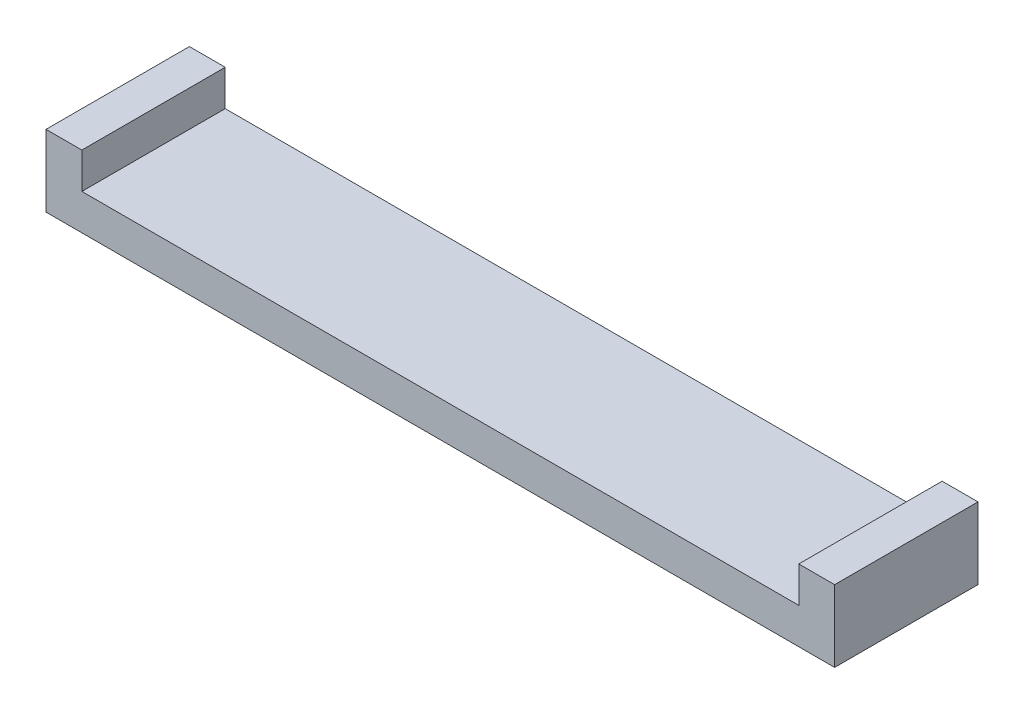
ISO-10303-21;
HEADER;
FILE_DESCRIPTION(('STEP AP214'),'2;1');
FILE_NAME('part.step','',(''),(''),'','','');
FILE_SCHEMA(('AUTOMOTIVE_DESIGN { 1 0 10303 214 1 1 1 1 }'));
ENDSEC;
DATA;
#1=APPLICATION_CONTEXT('core data for automotive mechanical design processes');
#2=APPLICATION_PROTOCOL_DEFINITION('international standard','automotive_design',2000,#1);
#3=PRODUCT_CONTEXT('',#1,'mechanical');
#4=PRODUCT('Part','Part','',(#3));
#5=PRODUCT_RELATED_PRODUCT_CATEGORY('part','',(#4));
#6=PRODUCT_DEFINITION_FORMATION('','',#4);
#7=PRODUCT_DEFINITION_CONTEXT('part definition',#1,'design');
#8=PRODUCT_DEFINITION('design','',#6,#7);
#9=PRODUCT_DEFINITION_SHAPE('','',#8);
#10=(LENGTH_UNIT() NAMED_UNIT(*) SI_UNIT(.MILLI.,.METRE.));
#11=(NAMED_UNIT(*) PLANE_ANGLE_UNIT() SI_UNIT($,.RADIAN.));
#12=(NAMED_UNIT(*) SI_UNIT($,.STERADIAN.) SOLID_ANGLE_UNIT());
#13=UNCERTAINTY_MEASURE_WITH_UNIT(LENGTH_MEASURE(1.E-05),#10,'distance_accuracy_value','');
#14=(GEOMETRIC_REPRESENTATION_CONTEXT(3) GLOBAL_UNCERTAINTY_ASSIGNED_CONTEXT((#13)) GLOBAL_UNIT_ASSIGNED_CONTEXT((#10,
#11,#12)) REPRESENTATION_CONTEXT('',''));
#15=CARTESIAN_POINT('',(0.,0.,0.));
#16=DIRECTION('',(0.,0.,1.));
#17=DIRECTION('',(1.,0.,0.));
#18=AXIS2_PLACEMENT_3D('',#15,#16,#17);
#19=CARTESIAN_POINT('',(-5.,5.,20.));
#20=DIRECTION('',(1.,0.,0.));
#21=DIRECTION('',(0.,0.,-1.));
#22=AXIS2_PLACEMENT_3D('',#19,#20,#21);
#23=PLANE('',#22);
#24=DIRECTION('',(0.,-1.,0.));
#25=VECTOR('',#24,1.);
#26=CARTESIAN_POINT('',(-5.,5.,0.));
#27=LINE('',#26,#25);
#28=CARTESIAN_POINT('',(-5.,5.,0.));
#29=VERTEX_POINT('',#28);
#30=CARTESIAN_POINT('',(-5.,-5.,0.));
#31=VERTEX_POINT('',#30);
#32=EDGE_CURVE('E134',#29,#31,#27,.T.);
#33=ORIENTED_EDGE('',*,*,#32,.T.);
#34=DIRECTION('',(0.,0.,-1.));
#35=VECTOR('',#34,1.);
#36=CARTESIAN_POINT('',(-5.,-5.,20.));
#37=LINE('',#36,#35);
#38=CARTESIAN_POINT('',(-5.,-5.,20.));
#39=VERTEX_POINT('',#38);
#40=EDGE_CURVE('E11',#39,#31,#37,.T.);
#41=ORIENTED_EDGE('',*,*,#40,.F.);
#42=DIRECTION('',(0.,-1.,0.));
#43=VECTOR('',#42,1.);
#44=CARTESIAN_POINT('',(-5.,5.,20.));
#45=LINE('',#44,#43);
#46=CARTESIAN_POINT('',(-5.,5.,20.));
#47=VERTEX_POINT('',#46);
#48=EDGE_CURVE('E146',#47,#39,#45,.T.);
#49=ORIENTED_EDGE('',*,*,#48,.F.);
#50=DIRECTION('',(0.,0.,-1.));
#51=VECTOR('',#50,1.);
#52=CARTESIAN_POINT('',(-5.,5.,20.));
#53=LINE('',#52,#51);
#54=EDGE_CURVE('E131',#47,#29,#53,.T.);
#55=ORIENTED_EDGE('',*,*,#54,.T.);
#56=EDGE_LOOP('',(#33,#41,#49,#55));
#57=FACE_BOUND('',#56,.T.);
#58=ADVANCED_FACE('F39',(#57),#23,.F.);
#59=CARTESIAN_POINT('',(-5.,-5.,20.));
#60=DIRECTION('',(0.,1.,0.));
#61=DIRECTION('',(0.,0.,1.));
#62=AXIS2_PLACEMENT_3D('',#59,#60,#61);
#63=PLANE('',#62);
#64=DIRECTION('',(1.,0.,0.));
#65=VECTOR('',#64,1.);
#66=CARTESIAN_POINT('',(-5.,-5.,0.));
#67=LINE('',#66,#65);
#68=CARTESIAN_POINT('',(105.,-5.,0.));
#69=VERTEX_POINT('',#68);
#70=EDGE_CURVE('E138',#31,#69,#67,.T.);
#71=ORIENTED_EDGE('',*,*,#70,.T.);
#72=DIRECTION('',(0.,0.,-1.));
#73=VECTOR('',#72,1.);
#74=CARTESIAN_POINT('',(105.,-5.,20.));
#75=LINE('',#74,#73);
#76=CARTESIAN_POINT('',(105.,-5.,20.));
#77=VERTEX_POINT('',#76);
#78=EDGE_CURVE('E50',#77,#69,#75,.T.);
#79=ORIENTED_EDGE('',*,*,#78,.F.);
#80=DIRECTION('',(1.,0.,0.));
#81=VECTOR('',#80,1.);
#82=CARTESIAN_POINT('',(-5.,-5.,20.));
#83=LINE('',#82,#81);
#84=EDGE_CURVE('E97',#39,#77,#83,.T.);
#85=ORIENTED_EDGE('',*,*,#84,.F.);
#86=ORIENTED_EDGE('',*,*,#40,.T.);
#87=EDGE_LOOP('',(#71,#79,#85,#86));
#88=FACE_BOUND('',#87,.T.);
#89=ADVANCED_FACE('F182',(#88),#63,.F.);
#90=CARTESIAN_POINT('',(105.,-5.,20.));
#91=DIRECTION('',(-1.,0.,0.));
#92=DIRECTION('',(0.,0.,1.));
#93=AXIS2_PLACEMENT_3D('',#90,#91,#92);
#94=PLANE('',#93);
#95=DIRECTION('',(0.,1.,0.));
#96=VECTOR('',#95,1.);
#97=CARTESIAN_POINT('',(105.,-5.,0.));
#98=LINE('',#97,#96);
#99=CARTESIAN_POINT('',(105.,5.,0.));
#100=VERTEX_POINT('',#99);
#101=EDGE_CURVE('E139',#69,#100,#98,.T.);
#102=ORIENTED_EDGE('',*,*,#101,.T.);
#103=DIRECTION('',(0.,0.,-1.));
#104=VECTOR('',#103,1.);
#105=CARTESIAN_POINT('',(105.,5.,20.));
#106=LINE('',#105,#104);
#107=CARTESIAN_POINT('',(105.,5.,20.));
#108=VERTEX_POINT('',#107);
#109=EDGE_CURVE('E157',#108,#100,#106,.T.);
#110=ORIENTED_EDGE('',*,*,#109,.F.);
#111=DIRECTION('',(0.,1.,0.));
#112=VECTOR('',#111,1.);
#113=CARTESIAN_POINT('',(105.,-5.,20.));
#114=LINE('',#113,#112);
#115=EDGE_CURVE('E163',#77,#108,#114,.T.);
#116=ORIENTED_EDGE('',*,*,#115,.F.);
#117=ORIENTED_EDGE('',*,*,#78,.T.);
#118=EDGE_LOOP('',(#102,#110,#116,#117));
#119=FACE_BOUND('',#118,.T.);
#120=ADVANCED_FACE('F162',(#119),#94,.F.);
#121=CARTESIAN_POINT('',(105.,5.,20.));
#122=DIRECTION('',(0.,-1.,0.));
#123=DIRECTION('',(0.,0.,-1.));
#124=AXIS2_PLACEMENT_3D('',#121,#122,#123);
#125=PLANE('',#124);
#126=DIRECTION('',(-1.,0.,0.));
#127=VECTOR('',#126,1.);
#128=CARTESIAN_POINT('',(105.,5.,0.));
#129=LINE('',#128,#127);
#130=CARTESIAN_POINT('',(100.,5.,0.));
#131=VERTEX_POINT('',#130);
#132=EDGE_CURVE('E145',#100,#131,#129,.T.);
#133=ORIENTED_EDGE('',*,*,#132,.T.);
#134=DIRECTION('',(0.,0.,-1.));
#135=VECTOR('',#134,1.);
#136=CARTESIAN_POINT('',(100.,5.,20.));
#137=LINE('',#136,#135);
#138=CARTESIAN_POINT('',(100.,5.,20.));
#139=VERTEX_POINT('',#138);
#140=EDGE_CURVE('E154',#139,#131,#137,.T.);
#141=ORIENTED_EDGE('',*,*,#140,.F.);
#142=DIRECTION('',(-1.,0.,0.));
#143=VECTOR('',#142,1.);
#144=CARTESIAN_POINT('',(105.,5.,20.));
#145=LINE('',#144,#143);
#146=EDGE_CURVE('E176',#108,#139,#145,.T.);
#147=ORIENTED_EDGE('',*,*,#146,.F.);
#148=ORIENTED_EDGE('',*,*,#109,.T.);
#149=EDGE_LOOP('',(#133,#141,#147,#148));
#150=FACE_BOUND('',#149,.T.);
#151=ADVANCED_FACE('F175',(#150),#125,.F.);
#152=CARTESIAN_POINT('',(100.,5.,20.));
#153=DIRECTION('',(1.,0.,0.));
#154=DIRECTION('',(0.,0.,-1.));
#155=AXIS2_PLACEMENT_3D('',#152,#153,#154);
#156=PLANE('',#155);
#157=DIRECTION('',(0.,-1.,0.));
#158=VECTOR('',#157,1.);
#159=CARTESIAN_POINT('',(100.,5.,0.));
#160=LINE('',#159,#158);
#161=CARTESIAN_POINT('',(100.,0.,0.));
#162=VERTEX_POINT('',#161);
#163=EDGE_CURVE('E143',#131,#162,#160,.T.);
#164=ORIENTED_EDGE('',*,*,#163,.T.);
#165=DIRECTION('',(0.,0.,-1.));
#166=VECTOR('',#165,1.);
#167=CARTESIAN_POINT('',(100.,0.,20.));
#168=LINE('',#167,#166);
#169=CARTESIAN_POINT('',(100.,0.,20.));
#170=VERTEX_POINT('',#169);
#171=EDGE_CURVE('E128',#170,#162,#168,.T.);
#172=ORIENTED_EDGE('',*,*,#171,.F.);
#173=DIRECTION('',(0.,-1.,0.));
#174=VECTOR('',#173,1.);
#175=CARTESIAN_POINT('',(100.,5.,20.));
#176=LINE('',#175,#174);
#177=EDGE_CURVE('E117',#139,#170,#176,.T.);
#178=ORIENTED_EDGE('',*,*,#177,.F.);
#179=ORIENTED_EDGE('',*,*,#140,.T.);
#180=EDGE_LOOP('',(#164,#172,#178,#179));
#181=FACE_BOUND('',#180,.T.);
#182=ADVANCED_FACE('F172',(#181),#156,.F.);
#183=CARTESIAN_POINT('',(100.,0.,20.));
#184=DIRECTION('',(0.,-1.,0.));
#185=DIRECTION('',(0.,0.,-1.));
#186=AXIS2_PLACEMENT_3D('',#183,#184,#185);
#187=PLANE('',#186);
#188=DIRECTION('',(-1.,0.,0.));
#189=VECTOR('',#188,1.);
#190=CARTESIAN_POINT('',(100.,0.,0.));
#191=LINE('',#190,#189);
#192=CARTESIAN_POINT('',(0.,0.,0.));
#193=VERTEX_POINT('',#192);
#194=EDGE_CURVE('E124',#162,#193,#191,.T.);
#195=ORIENTED_EDGE('',*,*,#194,.T.);
#196=DIRECTION('',(0.,0.,-1.));
#197=VECTOR('',#196,1.);
#198=CARTESIAN_POINT('',(0.,0.,20.));
#199=LINE('',#198,#197);
#200=CARTESIAN_POINT('',(0.,0.,20.));
#201=VERTEX_POINT('',#200);
#202=EDGE_CURVE('E122',#201,#193,#199,.T.);
#203=ORIENTED_EDGE('',*,*,#202,.F.);
#204=DIRECTION('',(-1.,0.,0.));
#205=VECTOR('',#204,1.);
#206=CARTESIAN_POINT('',(100.,0.,20.));
#207=LINE('',#206,#205);
#208=EDGE_CURVE('E112',#170,#201,#207,.T.);
#209=ORIENTED_EDGE('',*,*,#208,.F.);
#210=ORIENTED_EDGE('',*,*,#171,.T.);
#211=EDGE_LOOP('',(#195,#203,#209,#210));
#212=FACE_BOUND('',#211,.T.);
#213=ADVANCED_FACE('F121',(#212),#187,.F.);
#214=CARTESIAN_POINT('',(0.,0.,20.));
#215=DIRECTION('',(-1.,0.,0.));
#216=DIRECTION('',(0.,0.,1.));
#217=AXIS2_PLACEMENT_3D('',#214,#215,#216);
#218=PLANE('',#217);
#219=DIRECTION('',(0.,1.,0.));
#220=VECTOR('',#219,1.);
#221=CARTESIAN_POINT('',(0.,0.,0.));
#222=LINE('',#221,#220);
#223=CARTESIAN_POINT('',(0.,5.,0.));
#224=VERTEX_POINT('',#223);
#225=EDGE_CURVE('E84',#193,#224,#222,.T.);
#226=ORIENTED_EDGE('',*,*,#225,.T.);
#227=DIRECTION('',(0.,0.,-1.));
#228=VECTOR('',#227,1.);
#229=CARTESIAN_POINT('',(0.,5.,20.));
#230=LINE('',#229,#228);
#231=CARTESIAN_POINT('',(0.,5.,20.));
#232=VERTEX_POINT('',#231);
#233=EDGE_CURVE('E130',#232,#224,#230,.T.);
#234=ORIENTED_EDGE('',*,*,#233,.F.);
#235=DIRECTION('',(0.,1.,0.));
#236=VECTOR('',#235,1.);
#237=CARTESIAN_POINT('',(0.,0.,20.));
#238=LINE('',#237,#236);
#239=EDGE_CURVE('E113',#201,#232,#238,.T.);
#240=ORIENTED_EDGE('',*,*,#239,.F.);
#241=ORIENTED_EDGE('',*,*,#202,.T.);
#242=EDGE_LOOP('',(#226,#234,#240,#241));
#243=FACE_BOUND('',#242,.T.);
#244=ADVANCED_FACE('F129',(#243),#218,.F.);
#245=CARTESIAN_POINT('',(0.,5.,20.));
#246=DIRECTION('',(0.,-1.,0.));
#247=DIRECTION('',(0.,0.,-1.));
#248=AXIS2_PLACEMENT_3D('',#245,#246,#247);
#249=PLANE('',#248);
#250=DIRECTION('',(-1.,0.,0.));
#251=VECTOR('',#250,1.);
#252=CARTESIAN_POINT('',(0.,5.,0.));
#253=LINE('',#252,#251);
#254=EDGE_CURVE('E89',#224,#29,#253,.T.);
#255=ORIENTED_EDGE('',*,*,#254,.T.);
#256=ORIENTED_EDGE('',*,*,#54,.F.);
#257=DIRECTION('',(-1.,0.,0.));
#258=VECTOR('',#257,1.);
#259=CARTESIAN_POINT('',(0.,5.,20.));
#260=LINE('',#259,#258);
#261=EDGE_CURVE('E54',#232,#47,#260,.T.);
#262=ORIENTED_EDGE('',*,*,#261,.F.);
#263=ORIENTED_EDGE('',*,*,#233,.T.);
#264=EDGE_LOOP('',(#255,#256,#262,#263));
#265=FACE_BOUND('',#264,.T.);
#266=ADVANCED_FACE('F200',(#265),#249,.F.);
#267=CARTESIAN_POINT('',(0.,0.,20.));
#268=DIRECTION('',(0.,0.,1.));
#269=DIRECTION('',(1.,0.,0.));
#270=AXIS2_PLACEMENT_3D('',#267,#268,#269);
#271=PLANE('',#270);
#272=ORIENTED_EDGE('',*,*,#48,.T.);
#273=ORIENTED_EDGE('',*,*,#84,.T.);
#274=ORIENTED_EDGE('',*,*,#115,.T.);
#275=ORIENTED_EDGE('',*,*,#146,.T.);
#276=ORIENTED_EDGE('',*,*,#177,.T.);
#277=ORIENTED_EDGE('',*,*,#208,.T.);
#278=ORIENTED_EDGE('',*,*,#239,.T.);
#279=ORIENTED_EDGE('',*,*,#261,.T.);
#280=EDGE_LOOP('',(#272,#273,#274,#275,#276,#277,#278,#279));
#281=FACE_BOUND('',#280,.T.);
#282=ADVANCED_FACE('F111',(#281),#271,.T.);
#283=CARTESIAN_POINT('',(0.,0.,0.));
#284=DIRECTION('',(0.,0.,1.));
#285=DIRECTION('',(1.,0.,0.));
#286=AXIS2_PLACEMENT_3D('',#283,#284,#285);
#287=PLANE('',#286);
#288=ORIENTED_EDGE('',*,*,#32,.F.);
#289=ORIENTED_EDGE('',*,*,#254,.F.);
#290=ORIENTED_EDGE('',*,*,#225,.F.);
#291=ORIENTED_EDGE('',*,*,#194,.F.);
#292=ORIENTED_EDGE('',*,*,#163,.F.);
#293=ORIENTED_EDGE('',*,*,#132,.F.);
#294=ORIENTED_EDGE('',*,*,#101,.F.);
#295=ORIENTED_EDGE('',*,*,#70,.F.);
#296=EDGE_LOOP('',(#288,#289,#290,#291,#292,#293,#294,#295));
#297=FACE_BOUND('',#296,.T.);
#298=ADVANCED_FACE('F166',(#297),#287,.F.);
#299=CLOSED_SHELL('',(#58,#89,#120,#151,#182,#213,#244,#266,#282,#298));
#300=MANIFOLD_SOLID_BREP('B2',#299);
#301=ADVANCED_BREP_SHAPE_REPRESENTATION('',(#18,#300),#14);
#302=SHAPE_DEFINITION_REPRESENTATION(#9,#301);
ENDSEC;
END-ISO-10303-21;
